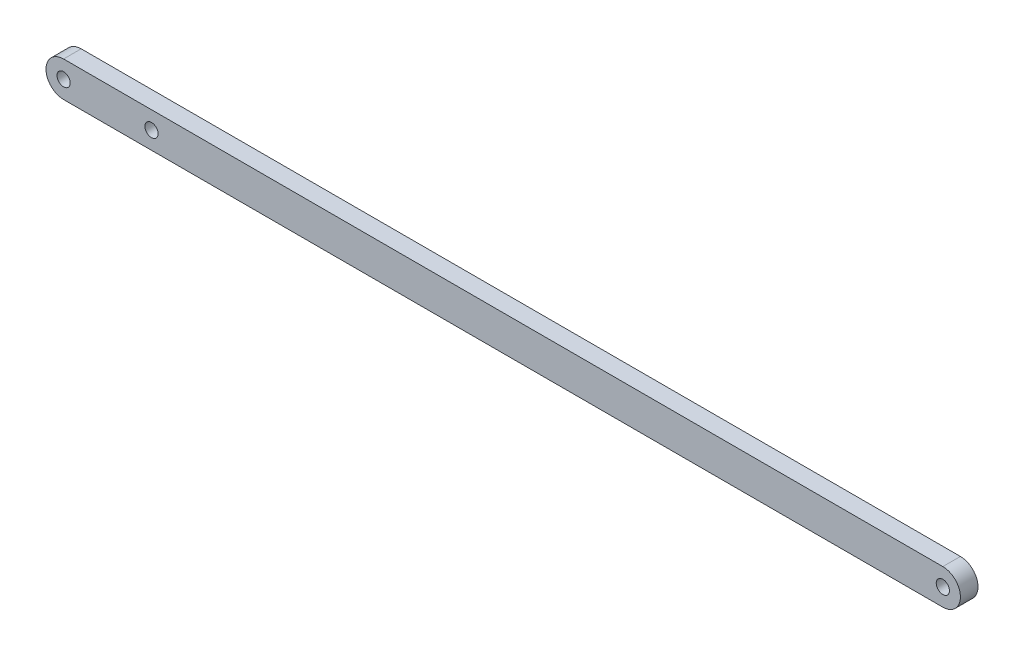
ISO-10303-21;
HEADER;
FILE_DESCRIPTION(('STEP AP214'),'2;1');
FILE_NAME('part.step','',(''),(''),'','','');
FILE_SCHEMA(('AUTOMOTIVE_DESIGN { 1 0 10303 214 1 1 1 1 }'));
ENDSEC;
DATA;
#1=APPLICATION_CONTEXT('core data for automotive mechanical design processes');
#2=APPLICATION_PROTOCOL_DEFINITION('international standard','automotive_design',2000,#1);
#3=PRODUCT_CONTEXT('',#1,'mechanical');
#4=PRODUCT('Part','Part','',(#3));
#5=PRODUCT_RELATED_PRODUCT_CATEGORY('part','',(#4));
#6=PRODUCT_DEFINITION_FORMATION('','',#4);
#7=PRODUCT_DEFINITION_CONTEXT('part definition',#1,'design');
#8=PRODUCT_DEFINITION('design','',#6,#7);
#9=PRODUCT_DEFINITION_SHAPE('','',#8);
#10=(LENGTH_UNIT() NAMED_UNIT(*) SI_UNIT(.MILLI.,.METRE.));
#11=(NAMED_UNIT(*) PLANE_ANGLE_UNIT() SI_UNIT($,.RADIAN.));
#12=(NAMED_UNIT(*) SI_UNIT($,.STERADIAN.) SOLID_ANGLE_UNIT());
#13=UNCERTAINTY_MEASURE_WITH_UNIT(LENGTH_MEASURE(1.E-05),#10,'distance_accuracy_value','');
#14=(GEOMETRIC_REPRESENTATION_CONTEXT(3) GLOBAL_UNCERTAINTY_ASSIGNED_CONTEXT((#13)) GLOBAL_UNIT_ASSIGNED_CONTEXT((#10,
#11,#12)) REPRESENTATION_CONTEXT('',''));
#15=CARTESIAN_POINT('',(0.,0.,0.));
#16=DIRECTION('',(0.,0.,1.));
#17=DIRECTION('',(1.,0.,0.));
#18=AXIS2_PLACEMENT_3D('',#15,#16,#17);
#19=CARTESIAN_POINT('',(159.757575757576,0.,4.));
#20=DIRECTION('',(0.,0.,1.));
#21=DIRECTION('',(1.,0.,0.));
#22=AXIS2_PLACEMENT_3D('',#19,#20,#21);
#23=PLANE('',#22);
#24=CARTESIAN_POINT('',(-40.2424242424243,0.,4.));
#25=DIRECTION('',(0.,0.,1.));
#26=DIRECTION('',(1.,0.,0.));
#27=AXIS2_PLACEMENT_3D('',#24,#25,#26);
#28=CIRCLE('',#27,1.5);
#29=CARTESIAN_POINT('',(-38.7424242424243,0.,4.));
#30=VERTEX_POINT('',#29);
#31=EDGE_CURVE('E134',#30,#30,#28,.T.);
#32=ORIENTED_EDGE('',*,*,#31,.F.);
#33=EDGE_LOOP('',(#32));
#34=FACE_BOUND('',#33,.T.);
#35=CARTESIAN_POINT('',(159.757575757576,0.,4.));
#36=DIRECTION('',(0.,0.,1.));
#37=DIRECTION('',(1.,0.,0.));
#38=AXIS2_PLACEMENT_3D('',#35,#36,#37);
#39=CIRCLE('',#38,4.);
#40=CARTESIAN_POINT('',(159.757575757576,-3.99999999999999,4.));
#41=VERTEX_POINT('',#40);
#42=CARTESIAN_POINT('',(159.757575757576,4.00000000000001,4.));
#43=VERTEX_POINT('',#42);
#44=EDGE_CURVE('E92',#41,#43,#39,.T.);
#45=ORIENTED_EDGE('',*,*,#44,.T.);
#46=DIRECTION('',(-1.,0.,0.));
#47=VECTOR('',#46,1.);
#48=CARTESIAN_POINT('',(159.757575757576,4.00000000000001,4.));
#49=LINE('',#48,#47);
#50=CARTESIAN_POINT('',(-40.2424242424243,4.,4.));
#51=VERTEX_POINT('',#50);
#52=EDGE_CURVE('E87',#43,#51,#49,.T.);
#53=ORIENTED_EDGE('',*,*,#52,.T.);
#54=CARTESIAN_POINT('',(-40.2424242424243,0.,4.));
#55=DIRECTION('',(0.,0.,1.));
#56=DIRECTION('',(1.,0.,0.));
#57=AXIS2_PLACEMENT_3D('',#54,#55,#56);
#58=CIRCLE('',#57,4.);
#59=CARTESIAN_POINT('',(-40.2424242424243,-4.,4.));
#60=VERTEX_POINT('',#59);
#61=EDGE_CURVE('E90',#51,#60,#58,.T.);
#62=ORIENTED_EDGE('',*,*,#61,.T.);
#63=DIRECTION('',(1.,0.,0.));
#64=VECTOR('',#63,1.);
#65=CARTESIAN_POINT('',(159.757575757576,-3.99999999999999,4.));
#66=LINE('',#65,#64);
#67=EDGE_CURVE('E57',#60,#41,#66,.T.);
#68=ORIENTED_EDGE('',*,*,#67,.T.);
#69=EDGE_LOOP('',(#45,#53,#62,#68));
#70=FACE_BOUND('',#69,.T.);
#71=CARTESIAN_POINT('',(-20.2424242424243,0.,4.));
#72=DIRECTION('',(0.,0.,1.));
#73=DIRECTION('',(1.,0.,0.));
#74=AXIS2_PLACEMENT_3D('',#71,#72,#73);
#75=CIRCLE('',#74,1.5);
#76=CARTESIAN_POINT('',(-18.7424242424243,0.,4.));
#77=VERTEX_POINT('',#76);
#78=EDGE_CURVE('E112',#77,#77,#75,.T.);
#79=ORIENTED_EDGE('',*,*,#78,.F.);
#80=EDGE_LOOP('',(#79));
#81=FACE_BOUND('',#80,.T.);
#82=CARTESIAN_POINT('',(159.757575757576,0.,4.));
#83=DIRECTION('',(0.,0.,1.));
#84=DIRECTION('',(1.,0.,0.));
#85=AXIS2_PLACEMENT_3D('',#82,#83,#84);
#86=CIRCLE('',#85,1.5);
#87=CARTESIAN_POINT('',(161.257575757576,0.,4.));
#88=VERTEX_POINT('',#87);
#89=EDGE_CURVE('E142',#88,#88,#86,.T.);
#90=ORIENTED_EDGE('',*,*,#89,.F.);
#91=EDGE_LOOP('',(#90));
#92=FACE_BOUND('',#91,.T.);
#93=ADVANCED_FACE('F39',(#34,#70,#81,#92),#23,.T.);
#94=CARTESIAN_POINT('',(159.757575757576,0.,0.));
#95=DIRECTION('',(0.,0.,1.));
#96=DIRECTION('',(1.,0.,0.));
#97=AXIS2_PLACEMENT_3D('',#94,#95,#96);
#98=PLANE('',#97);
#99=CARTESIAN_POINT('',(159.757575757576,0.,0.));
#100=DIRECTION('',(0.,0.,1.));
#101=DIRECTION('',(1.,0.,0.));
#102=AXIS2_PLACEMENT_3D('',#99,#100,#101);
#103=CIRCLE('',#102,4.);
#104=CARTESIAN_POINT('',(159.757575757576,-3.99999999999999,0.));
#105=VERTEX_POINT('',#104);
#106=CARTESIAN_POINT('',(159.757575757576,4.00000000000001,0.));
#107=VERTEX_POINT('',#106);
#108=EDGE_CURVE('E108',#105,#107,#103,.T.);
#109=ORIENTED_EDGE('',*,*,#108,.F.);
#110=DIRECTION('',(1.,0.,0.));
#111=VECTOR('',#110,1.);
#112=CARTESIAN_POINT('',(159.757575757576,-3.99999999999999,0.));
#113=LINE('',#112,#111);
#114=CARTESIAN_POINT('',(-40.2424242424243,-4.,0.));
#115=VERTEX_POINT('',#114);
#116=EDGE_CURVE('E80',#115,#105,#113,.T.);
#117=ORIENTED_EDGE('',*,*,#116,.F.);
#118=CARTESIAN_POINT('',(-40.2424242424243,0.,0.));
#119=DIRECTION('',(0.,0.,1.));
#120=DIRECTION('',(1.,0.,0.));
#121=AXIS2_PLACEMENT_3D('',#118,#119,#120);
#122=CIRCLE('',#121,4.);
#123=CARTESIAN_POINT('',(-40.2424242424243,4.,0.));
#124=VERTEX_POINT('',#123);
#125=EDGE_CURVE('E74',#124,#115,#122,.T.);
#126=ORIENTED_EDGE('',*,*,#125,.F.);
#127=DIRECTION('',(-1.,0.,0.));
#128=VECTOR('',#127,1.);
#129=CARTESIAN_POINT('',(159.757575757576,4.00000000000001,0.));
#130=LINE('',#129,#128);
#131=EDGE_CURVE('E97',#107,#124,#130,.T.);
#132=ORIENTED_EDGE('',*,*,#131,.F.);
#133=EDGE_LOOP('',(#109,#117,#126,#132));
#134=FACE_BOUND('',#133,.T.);
#135=CARTESIAN_POINT('',(-20.2424242424243,0.,0.));
#136=DIRECTION('',(0.,0.,1.));
#137=DIRECTION('',(1.,0.,0.));
#138=AXIS2_PLACEMENT_3D('',#135,#136,#137);
#139=CIRCLE('',#138,1.5);
#140=CARTESIAN_POINT('',(-18.7424242424243,0.,0.));
#141=VERTEX_POINT('',#140);
#142=EDGE_CURVE('E130',#141,#141,#139,.T.);
#143=ORIENTED_EDGE('',*,*,#142,.T.);
#144=EDGE_LOOP('',(#143));
#145=FACE_BOUND('',#144,.T.);
#146=CARTESIAN_POINT('',(-40.2424242424243,0.,0.));
#147=DIRECTION('',(0.,0.,1.));
#148=DIRECTION('',(1.,0.,0.));
#149=AXIS2_PLACEMENT_3D('',#146,#147,#148);
#150=CIRCLE('',#149,1.5);
#151=CARTESIAN_POINT('',(-38.7424242424243,0.,0.));
#152=VERTEX_POINT('',#151);
#153=EDGE_CURVE('E138',#152,#152,#150,.T.);
#154=ORIENTED_EDGE('',*,*,#153,.T.);
#155=EDGE_LOOP('',(#154));
#156=FACE_BOUND('',#155,.T.);
#157=CARTESIAN_POINT('',(159.757575757576,0.,0.));
#158=DIRECTION('',(0.,0.,1.));
#159=DIRECTION('',(1.,0.,0.));
#160=AXIS2_PLACEMENT_3D('',#157,#158,#159);
#161=CIRCLE('',#160,1.5);
#162=CARTESIAN_POINT('',(161.257575757576,0.,0.));
#163=VERTEX_POINT('',#162);
#164=EDGE_CURVE('E146',#163,#163,#161,.T.);
#165=ORIENTED_EDGE('',*,*,#164,.T.);
#166=EDGE_LOOP('',(#165));
#167=FACE_BOUND('',#166,.T.);
#168=ADVANCED_FACE('F125',(#134,#145,#156,#167),#98,.F.);
#169=CARTESIAN_POINT('',(159.757575757576,0.,4.));
#170=DIRECTION('',(0.,0.,-1.));
#171=DIRECTION('',(-1.,0.,0.));
#172=AXIS2_PLACEMENT_3D('',#169,#170,#171);
#173=CYLINDRICAL_SURFACE('',#172,4.);
#174=ORIENTED_EDGE('',*,*,#108,.T.);
#175=DIRECTION('',(0.,0.,-1.));
#176=VECTOR('',#175,1.);
#177=CARTESIAN_POINT('',(159.757575757576,4.00000000000001,4.));
#178=LINE('',#177,#176);
#179=EDGE_CURVE('E11',#43,#107,#178,.T.);
#180=ORIENTED_EDGE('',*,*,#179,.F.);
#181=ORIENTED_EDGE('',*,*,#44,.F.);
#182=DIRECTION('',(0.,0.,-1.));
#183=VECTOR('',#182,1.);
#184=CARTESIAN_POINT('',(159.757575757576,-3.99999999999999,4.));
#185=LINE('',#184,#183);
#186=EDGE_CURVE('E104',#41,#105,#185,.T.);
#187=ORIENTED_EDGE('',*,*,#186,.T.);
#188=EDGE_LOOP('',(#174,#180,#181,#187));
#189=FACE_BOUND('',#188,.T.);
#190=ADVANCED_FACE('F41',(#189),#173,.T.);
#191=CARTESIAN_POINT('',(159.757575757576,4.00000000000001,4.));
#192=DIRECTION('',(0.,-1.,0.));
#193=DIRECTION('',(1.,0.,0.));
#194=AXIS2_PLACEMENT_3D('',#191,#192,#193);
#195=PLANE('',#194);
#196=ORIENTED_EDGE('',*,*,#131,.T.);
#197=DIRECTION('',(0.,0.,-1.));
#198=VECTOR('',#197,1.);
#199=CARTESIAN_POINT('',(-40.2424242424243,4.,4.));
#200=LINE('',#199,#198);
#201=EDGE_CURVE('E49',#51,#124,#200,.T.);
#202=ORIENTED_EDGE('',*,*,#201,.F.);
#203=ORIENTED_EDGE('',*,*,#52,.F.);
#204=ORIENTED_EDGE('',*,*,#179,.T.);
#205=EDGE_LOOP('',(#196,#202,#203,#204));
#206=FACE_BOUND('',#205,.T.);
#207=ADVANCED_FACE('F96',(#206),#195,.F.);
#208=CARTESIAN_POINT('',(-40.2424242424243,0.,4.));
#209=DIRECTION('',(0.,0.,-1.));
#210=DIRECTION('',(-1.,0.,0.));
#211=AXIS2_PLACEMENT_3D('',#208,#209,#210);
#212=CYLINDRICAL_SURFACE('',#211,4.);
#213=ORIENTED_EDGE('',*,*,#125,.T.);
#214=DIRECTION('',(0.,0.,-1.));
#215=VECTOR('',#214,1.);
#216=CARTESIAN_POINT('',(-40.2424242424243,-4.,4.));
#217=LINE('',#216,#215);
#218=EDGE_CURVE('E99',#60,#115,#217,.T.);
#219=ORIENTED_EDGE('',*,*,#218,.F.);
#220=ORIENTED_EDGE('',*,*,#61,.F.);
#221=ORIENTED_EDGE('',*,*,#201,.T.);
#222=EDGE_LOOP('',(#213,#219,#220,#221));
#223=FACE_BOUND('',#222,.T.);
#224=ADVANCED_FACE('F100',(#223),#212,.T.);
#225=CARTESIAN_POINT('',(159.757575757576,-3.99999999999999,4.));
#226=DIRECTION('',(0.,1.,0.));
#227=DIRECTION('',(-1.,0.,0.));
#228=AXIS2_PLACEMENT_3D('',#225,#226,#227);
#229=PLANE('',#228);
#230=ORIENTED_EDGE('',*,*,#116,.T.);
#231=ORIENTED_EDGE('',*,*,#186,.F.);
#232=ORIENTED_EDGE('',*,*,#67,.F.);
#233=ORIENTED_EDGE('',*,*,#218,.T.);
#234=EDGE_LOOP('',(#230,#231,#232,#233));
#235=FACE_BOUND('',#234,.T.);
#236=ADVANCED_FACE('F122',(#235),#229,.F.);
#237=CARTESIAN_POINT('',(-20.2424242424243,0.,4.));
#238=DIRECTION('',(0.,0.,-1.));
#239=DIRECTION('',(-1.,0.,0.));
#240=AXIS2_PLACEMENT_3D('',#237,#238,#239);
#241=CYLINDRICAL_SURFACE('',#240,1.5);
#242=ORIENTED_EDGE('',*,*,#78,.T.);
#243=EDGE_LOOP('',(#242));
#244=FACE_BOUND('',#243,.T.);
#245=ORIENTED_EDGE('',*,*,#142,.F.);
#246=EDGE_LOOP('',(#245));
#247=FACE_BOUND('',#246,.T.);
#248=ADVANCED_FACE('F166',(#244,#247),#241,.F.);
#249=CARTESIAN_POINT('',(-40.2424242424243,0.,4.));
#250=DIRECTION('',(0.,0.,-1.));
#251=DIRECTION('',(-1.,0.,0.));
#252=AXIS2_PLACEMENT_3D('',#249,#250,#251);
#253=CYLINDRICAL_SURFACE('',#252,1.5);
#254=ORIENTED_EDGE('',*,*,#31,.T.);
#255=EDGE_LOOP('',(#254));
#256=FACE_BOUND('',#255,.T.);
#257=ORIENTED_EDGE('',*,*,#153,.F.);
#258=EDGE_LOOP('',(#257));
#259=FACE_BOUND('',#258,.T.);
#260=ADVANCED_FACE('F212',(#256,#259),#253,.F.);
#261=CARTESIAN_POINT('',(159.757575757576,0.,4.));
#262=DIRECTION('',(0.,0.,-1.));
#263=DIRECTION('',(-1.,0.,0.));
#264=AXIS2_PLACEMENT_3D('',#261,#262,#263);
#265=CYLINDRICAL_SURFACE('',#264,1.5);
#266=ORIENTED_EDGE('',*,*,#89,.T.);
#267=EDGE_LOOP('',(#266));
#268=FACE_BOUND('',#267,.T.);
#269=ORIENTED_EDGE('',*,*,#164,.F.);
#270=EDGE_LOOP('',(#269));
#271=FACE_BOUND('',#270,.T.);
#272=ADVANCED_FACE('F154',(#268,#271),#265,.F.);
#273=CLOSED_SHELL('',(#93,#168,#190,#207,#224,#236,#248,#260,#272));
#274=MANIFOLD_SOLID_BREP('B2',#273);
#275=ADVANCED_BREP_SHAPE_REPRESENTATION('',(#18,#274),#14);
#276=SHAPE_DEFINITION_REPRESENTATION(#9,#275);
ENDSEC;
END-ISO-10303-21;
